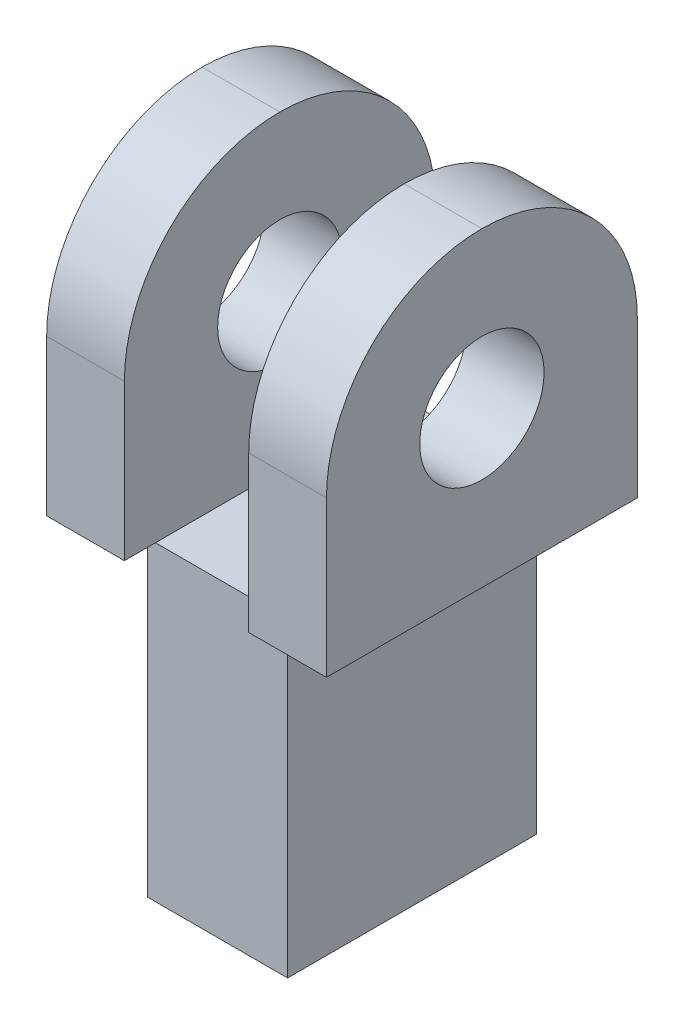
ISO-10303-21;
HEADER;
FILE_DESCRIPTION(('STEP AP214'),'2;1');
FILE_NAME('part.step','',(''),(''),'','','');
FILE_SCHEMA(('AUTOMOTIVE_DESIGN { 1 0 10303 214 1 1 1 1 }'));
ENDSEC;
DATA;
#1=APPLICATION_CONTEXT('core data for automotive mechanical design processes');
#2=APPLICATION_PROTOCOL_DEFINITION('international standard','automotive_design',2000,#1);
#3=PRODUCT_CONTEXT('',#1,'mechanical');
#4=PRODUCT('Part','Part','',(#3));
#5=PRODUCT_RELATED_PRODUCT_CATEGORY('part','',(#4));
#6=PRODUCT_DEFINITION_FORMATION('','',#4);
#7=PRODUCT_DEFINITION_CONTEXT('part definition',#1,'design');
#8=PRODUCT_DEFINITION('design','',#6,#7);
#9=PRODUCT_DEFINITION_SHAPE('','',#8);
#10=(LENGTH_UNIT() NAMED_UNIT(*) SI_UNIT(.MILLI.,.METRE.));
#11=(NAMED_UNIT(*) PLANE_ANGLE_UNIT() SI_UNIT($,.RADIAN.));
#12=(NAMED_UNIT(*) SI_UNIT($,.STERADIAN.) SOLID_ANGLE_UNIT());
#13=UNCERTAINTY_MEASURE_WITH_UNIT(LENGTH_MEASURE(1.E-05),#10,'distance_accuracy_value','');
#14=(GEOMETRIC_REPRESENTATION_CONTEXT(3) GLOBAL_UNCERTAINTY_ASSIGNED_CONTEXT((#13)) GLOBAL_UNIT_ASSIGNED_CONTEXT((#10,
#11,#12)) REPRESENTATION_CONTEXT('',''));
#15=CARTESIAN_POINT('',(0.,0.,0.));
#16=DIRECTION('',(0.,0.,1.));
#17=DIRECTION('',(1.,0.,0.));
#18=AXIS2_PLACEMENT_3D('',#15,#16,#17);
#19=CARTESIAN_POINT('',(0.,20.,0.));
#20=DIRECTION('',(0.,-1.,0.));
#21=DIRECTION('',(0.,0.,-1.));
#22=AXIS2_PLACEMENT_3D('',#19,#20,#21);
#23=PLANE('',#22);
#24=DIRECTION('',(0.,0.,-1.));
#25=VECTOR('',#24,1.);
#26=CARTESIAN_POINT('',(-4.,20.,-10.));
#27=LINE('',#26,#25);
#28=CARTESIAN_POINT('',(-4.,20.,8.));
#29=VERTEX_POINT('',#28);
#30=CARTESIAN_POINT('',(-4.,20.,-8.));
#31=VERTEX_POINT('',#30);
#32=EDGE_CURVE('E188',#29,#31,#27,.T.);
#33=ORIENTED_EDGE('',*,*,#32,.F.);
#34=DIRECTION('',(1.,0.,0.));
#35=VECTOR('',#34,1.);
#36=CARTESIAN_POINT('',(-4.5,20.,8.));
#37=LINE('',#36,#35);
#38=CARTESIAN_POINT('',(4.,20.,8.));
#39=VERTEX_POINT('',#38);
#40=EDGE_CURVE('E282',#29,#39,#37,.T.);
#41=ORIENTED_EDGE('',*,*,#40,.T.);
#42=DIRECTION('',(0.,0.,1.));
#43=VECTOR('',#42,1.);
#44=CARTESIAN_POINT('',(4.,20.,-10.));
#45=LINE('',#44,#43);
#46=CARTESIAN_POINT('',(4.,20.,-8.));
#47=VERTEX_POINT('',#46);
#48=EDGE_CURVE('E222',#47,#39,#45,.T.);
#49=ORIENTED_EDGE('',*,*,#48,.F.);
#50=DIRECTION('',(-1.,0.,0.));
#51=VECTOR('',#50,1.);
#52=CARTESIAN_POINT('',(-4.5,20.,-8.));
#53=LINE('',#52,#51);
#54=EDGE_CURVE('E269',#47,#31,#53,.T.);
#55=ORIENTED_EDGE('',*,*,#54,.T.);
#56=EDGE_LOOP('',(#33,#41,#49,#55));
#57=FACE_BOUND('',#56,.T.);
#58=ADVANCED_FACE('F33',(#57),#23,.F.);
#59=CARTESIAN_POINT('',(4.5,20.,8.));
#60=DIRECTION('',(-1.,0.,0.));
#61=DIRECTION('',(0.,0.,1.));
#62=AXIS2_PLACEMENT_3D('',#59,#60,#61);
#63=PLANE('',#62);
#64=DIRECTION('',(0.,0.,-1.));
#65=VECTOR('',#64,1.);
#66=CARTESIAN_POINT('',(4.5,0.,8.));
#67=LINE('',#66,#65);
#68=CARTESIAN_POINT('',(4.5,0.,8.));
#69=VERTEX_POINT('',#68);
#70=CARTESIAN_POINT('',(4.5,0.,-8.));
#71=VERTEX_POINT('',#70);
#72=EDGE_CURVE('E259',#69,#71,#67,.T.);
#73=ORIENTED_EDGE('',*,*,#72,.T.);
#74=DIRECTION('',(0.,-1.,0.));
#75=VECTOR('',#74,1.);
#76=CARTESIAN_POINT('',(4.5,20.,-8.));
#77=LINE('',#76,#75);
#78=CARTESIAN_POINT('',(4.5,20.,-8.));
#79=VERTEX_POINT('',#78);
#80=EDGE_CURVE('E298',#79,#71,#77,.T.);
#81=ORIENTED_EDGE('',*,*,#80,.F.);
#82=DIRECTION('',(0.,0.,-1.));
#83=VECTOR('',#82,1.);
#84=CARTESIAN_POINT('',(4.5,20.,8.));
#85=LINE('',#84,#83);
#86=CARTESIAN_POINT('',(4.5,20.,8.));
#87=VERTEX_POINT('',#86);
#88=EDGE_CURVE('E266',#87,#79,#85,.T.);
#89=ORIENTED_EDGE('',*,*,#88,.F.);
#90=DIRECTION('',(0.,-1.,0.));
#91=VECTOR('',#90,1.);
#92=CARTESIAN_POINT('',(4.5,20.,8.));
#93=LINE('',#92,#91);
#94=EDGE_CURVE('E281',#87,#69,#93,.T.);
#95=ORIENTED_EDGE('',*,*,#94,.T.);
#96=EDGE_LOOP('',(#73,#81,#89,#95));
#97=FACE_BOUND('',#96,.T.);
#98=ADVANCED_FACE('F373',(#97),#63,.F.);
#99=CARTESIAN_POINT('',(-4.5,20.,-8.));
#100=DIRECTION('',(0.,0.,1.));
#101=DIRECTION('',(1.,0.,0.));
#102=AXIS2_PLACEMENT_3D('',#99,#100,#101);
#103=PLANE('',#102);
#104=DIRECTION('',(-1.,0.,0.));
#105=VECTOR('',#104,1.);
#106=CARTESIAN_POINT('',(-4.5,0.,-8.));
#107=LINE('',#106,#105);
#108=CARTESIAN_POINT('',(-4.5,0.,-8.));
#109=VERTEX_POINT('',#108);
#110=EDGE_CURVE('E285',#71,#109,#107,.T.);
#111=ORIENTED_EDGE('',*,*,#110,.T.);
#112=DIRECTION('',(0.,-1.,0.));
#113=VECTOR('',#112,1.);
#114=CARTESIAN_POINT('',(-4.5,20.,-8.));
#115=LINE('',#114,#113);
#116=CARTESIAN_POINT('',(-4.5,20.,-8.));
#117=VERTEX_POINT('',#116);
#118=EDGE_CURVE('E295',#117,#109,#115,.T.);
#119=ORIENTED_EDGE('',*,*,#118,.F.);
#120=DIRECTION('',(-1.,0.,0.));
#121=VECTOR('',#120,1.);
#122=CARTESIAN_POINT('',(-4.5,20.,-8.));
#123=LINE('',#122,#121);
#124=EDGE_CURVE('E179',#31,#117,#123,.T.);
#125=ORIENTED_EDGE('',*,*,#124,.F.);
#126=ORIENTED_EDGE('',*,*,#54,.F.);
#127=EDGE_CURVE('E271',#79,#47,#53,.T.);
#128=ORIENTED_EDGE('',*,*,#127,.F.);
#129=ORIENTED_EDGE('',*,*,#80,.T.);
#130=EDGE_LOOP('',(#111,#119,#125,#126,#128,#129));
#131=FACE_BOUND('',#130,.T.);
#132=ADVANCED_FACE('F359',(#131),#103,.F.);
#133=CARTESIAN_POINT('',(-4.5,20.,8.));
#134=DIRECTION('',(1.,0.,0.));
#135=DIRECTION('',(0.,0.,-1.));
#136=AXIS2_PLACEMENT_3D('',#133,#134,#135);
#137=PLANE('',#136);
#138=DIRECTION('',(0.,0.,1.));
#139=VECTOR('',#138,1.);
#140=CARTESIAN_POINT('',(-4.5,0.,8.));
#141=LINE('',#140,#139);
#142=CARTESIAN_POINT('',(-4.5,0.,8.));
#143=VERTEX_POINT('',#142);
#144=EDGE_CURVE('E287',#109,#143,#141,.T.);
#145=ORIENTED_EDGE('',*,*,#144,.T.);
#146=DIRECTION('',(0.,-1.,0.));
#147=VECTOR('',#146,1.);
#148=CARTESIAN_POINT('',(-4.5,20.,8.));
#149=LINE('',#148,#147);
#150=CARTESIAN_POINT('',(-4.5,20.,8.));
#151=VERTEX_POINT('',#150);
#152=EDGE_CURVE('E292',#151,#143,#149,.T.);
#153=ORIENTED_EDGE('',*,*,#152,.F.);
#154=DIRECTION('',(0.,0.,1.));
#155=VECTOR('',#154,1.);
#156=CARTESIAN_POINT('',(-4.5,20.,8.));
#157=LINE('',#156,#155);
#158=EDGE_CURVE('E274',#117,#151,#157,.T.);
#159=ORIENTED_EDGE('',*,*,#158,.F.);
#160=ORIENTED_EDGE('',*,*,#118,.T.);
#161=EDGE_LOOP('',(#145,#153,#159,#160));
#162=FACE_BOUND('',#161,.T.);
#163=ADVANCED_FACE('F365',(#162),#137,.F.);
#164=CARTESIAN_POINT('',(-4.5,20.,8.));
#165=DIRECTION('',(0.,0.,-1.));
#166=DIRECTION('',(-1.,0.,0.));
#167=AXIS2_PLACEMENT_3D('',#164,#165,#166);
#168=PLANE('',#167);
#169=DIRECTION('',(1.,0.,0.));
#170=VECTOR('',#169,1.);
#171=CARTESIAN_POINT('',(-4.5,0.,8.));
#172=LINE('',#171,#170);
#173=EDGE_CURVE('E270',#143,#69,#172,.T.);
#174=ORIENTED_EDGE('',*,*,#173,.T.);
#175=ORIENTED_EDGE('',*,*,#94,.F.);
#176=EDGE_CURVE('E277',#39,#87,#37,.T.);
#177=ORIENTED_EDGE('',*,*,#176,.F.);
#178=ORIENTED_EDGE('',*,*,#40,.F.);
#179=EDGE_CURVE('E278',#151,#29,#37,.T.);
#180=ORIENTED_EDGE('',*,*,#179,.F.);
#181=ORIENTED_EDGE('',*,*,#152,.T.);
#182=EDGE_LOOP('',(#174,#175,#177,#178,#180,#181));
#183=FACE_BOUND('',#182,.T.);
#184=ADVANCED_FACE('F369',(#183),#168,.F.);
#185=CARTESIAN_POINT('',(0.,0.,0.));
#186=DIRECTION('',(0.,-1.,0.));
#187=DIRECTION('',(0.,0.,-1.));
#188=AXIS2_PLACEMENT_3D('',#185,#186,#187);
#189=PLANE('',#188);
#190=DIRECTION('',(0.,0.,1.));
#191=VECTOR('',#190,1.);
#192=CARTESIAN_POINT('',(4.1,0.,-7.6));
#193=LINE('',#192,#191);
#194=CARTESIAN_POINT('',(4.1,0.,-7.6));
#195=VERTEX_POINT('',#194);
#196=CARTESIAN_POINT('',(4.1,0.,7.6));
#197=VERTEX_POINT('',#196);
#198=EDGE_CURVE('E233',#195,#197,#193,.T.);
#199=ORIENTED_EDGE('',*,*,#198,.F.);
#200=DIRECTION('',(1.,0.,0.));
#201=VECTOR('',#200,1.);
#202=CARTESIAN_POINT('',(-4.1,0.,-7.6));
#203=LINE('',#202,#201);
#204=CARTESIAN_POINT('',(-4.1,0.,-7.6));
#205=VERTEX_POINT('',#204);
#206=EDGE_CURVE('E238',#205,#195,#203,.T.);
#207=ORIENTED_EDGE('',*,*,#206,.F.);
#208=DIRECTION('',(0.,0.,-1.));
#209=VECTOR('',#208,1.);
#210=CARTESIAN_POINT('',(-4.1,0.,-7.6));
#211=LINE('',#210,#209);
#212=CARTESIAN_POINT('',(-4.1,0.,7.6));
#213=VERTEX_POINT('',#212);
#214=EDGE_CURVE('E252',#213,#205,#211,.T.);
#215=ORIENTED_EDGE('',*,*,#214,.F.);
#216=DIRECTION('',(-1.,0.,0.));
#217=VECTOR('',#216,1.);
#218=CARTESIAN_POINT('',(-4.1,0.,7.6));
#219=LINE('',#218,#217);
#220=EDGE_CURVE('E249',#197,#213,#219,.T.);
#221=ORIENTED_EDGE('',*,*,#220,.F.);
#222=EDGE_LOOP('',(#199,#207,#215,#221));
#223=FACE_BOUND('',#222,.T.);
#224=ORIENTED_EDGE('',*,*,#72,.F.);
#225=ORIENTED_EDGE('',*,*,#173,.F.);
#226=ORIENTED_EDGE('',*,*,#144,.F.);
#227=ORIENTED_EDGE('',*,*,#110,.F.);
#228=EDGE_LOOP('',(#224,#225,#226,#227));
#229=FACE_BOUND('',#228,.T.);
#230=ADVANCED_FACE('F376',(#223,#229),#189,.T.);
#231=CARTESIAN_POINT('',(4.1,18.,-7.6));
#232=DIRECTION('',(1.,0.,0.));
#233=DIRECTION('',(0.,0.,-1.));
#234=AXIS2_PLACEMENT_3D('',#231,#232,#233);
#235=PLANE('',#234);
#236=ORIENTED_EDGE('',*,*,#198,.T.);
#237=DIRECTION('',(0.,-1.,0.));
#238=VECTOR('',#237,1.);
#239=CARTESIAN_POINT('',(4.1,18.,7.6));
#240=LINE('',#239,#238);
#241=CARTESIAN_POINT('',(4.1,18.,7.6));
#242=VERTEX_POINT('',#241);
#243=EDGE_CURVE('E247',#242,#197,#240,.T.);
#244=ORIENTED_EDGE('',*,*,#243,.F.);
#245=DIRECTION('',(0.,0.,1.));
#246=VECTOR('',#245,1.);
#247=CARTESIAN_POINT('',(4.1,18.,-7.6));
#248=LINE('',#247,#246);
#249=CARTESIAN_POINT('',(4.1,18.,-7.6));
#250=VERTEX_POINT('',#249);
#251=EDGE_CURVE('E234',#250,#242,#248,.T.);
#252=ORIENTED_EDGE('',*,*,#251,.F.);
#253=DIRECTION('',(0.,-1.,0.));
#254=VECTOR('',#253,1.);
#255=CARTESIAN_POINT('',(4.1,18.,-7.6));
#256=LINE('',#255,#254);
#257=EDGE_CURVE('E257',#250,#195,#256,.T.);
#258=ORIENTED_EDGE('',*,*,#257,.T.);
#259=EDGE_LOOP('',(#236,#244,#252,#258));
#260=FACE_BOUND('',#259,.T.);
#261=ADVANCED_FACE('F378',(#260),#235,.F.);
#262=CARTESIAN_POINT('',(-4.1,18.,-7.6));
#263=DIRECTION('',(0.,0.,-1.));
#264=DIRECTION('',(-1.,0.,0.));
#265=AXIS2_PLACEMENT_3D('',#262,#263,#264);
#266=PLANE('',#265);
#267=ORIENTED_EDGE('',*,*,#206,.T.);
#268=ORIENTED_EDGE('',*,*,#257,.F.);
#269=DIRECTION('',(1.,0.,0.));
#270=VECTOR('',#269,1.);
#271=CARTESIAN_POINT('',(-4.1,18.,-7.6));
#272=LINE('',#271,#270);
#273=CARTESIAN_POINT('',(-4.1,18.,-7.6));
#274=VERTEX_POINT('',#273);
#275=EDGE_CURVE('E244',#274,#250,#272,.T.);
#276=ORIENTED_EDGE('',*,*,#275,.F.);
#277=DIRECTION('',(0.,-1.,0.));
#278=VECTOR('',#277,1.);
#279=CARTESIAN_POINT('',(-4.1,18.,-7.6));
#280=LINE('',#279,#278);
#281=EDGE_CURVE('E260',#274,#205,#280,.T.);
#282=ORIENTED_EDGE('',*,*,#281,.T.);
#283=EDGE_LOOP('',(#267,#268,#276,#282));
#284=FACE_BOUND('',#283,.T.);
#285=ADVANCED_FACE('F385',(#284),#266,.F.);
#286=CARTESIAN_POINT('',(-4.1,18.,-7.6));
#287=DIRECTION('',(-1.,0.,0.));
#288=DIRECTION('',(0.,0.,1.));
#289=AXIS2_PLACEMENT_3D('',#286,#287,#288);
#290=PLANE('',#289);
#291=ORIENTED_EDGE('',*,*,#214,.T.);
#292=ORIENTED_EDGE('',*,*,#281,.F.);
#293=DIRECTION('',(0.,0.,-1.));
#294=VECTOR('',#293,1.);
#295=CARTESIAN_POINT('',(-4.1,18.,-7.6));
#296=LINE('',#295,#294);
#297=CARTESIAN_POINT('',(-4.1,18.,7.6));
#298=VERTEX_POINT('',#297);
#299=EDGE_CURVE('E241',#298,#274,#296,.T.);
#300=ORIENTED_EDGE('',*,*,#299,.F.);
#301=DIRECTION('',(0.,-1.,0.));
#302=VECTOR('',#301,1.);
#303=CARTESIAN_POINT('',(-4.1,18.,7.6));
#304=LINE('',#303,#302);
#305=EDGE_CURVE('E262',#298,#213,#304,.T.);
#306=ORIENTED_EDGE('',*,*,#305,.T.);
#307=EDGE_LOOP('',(#291,#292,#300,#306));
#308=FACE_BOUND('',#307,.T.);
#309=ADVANCED_FACE('F401',(#308),#290,.F.);
#310=CARTESIAN_POINT('',(-4.1,18.,7.6));
#311=DIRECTION('',(0.,0.,1.));
#312=DIRECTION('',(1.,0.,0.));
#313=AXIS2_PLACEMENT_3D('',#310,#311,#312);
#314=PLANE('',#313);
#315=ORIENTED_EDGE('',*,*,#220,.T.);
#316=ORIENTED_EDGE('',*,*,#305,.F.);
#317=DIRECTION('',(-1.,0.,0.));
#318=VECTOR('',#317,1.);
#319=CARTESIAN_POINT('',(-4.1,18.,7.6));
#320=LINE('',#319,#318);
#321=EDGE_CURVE('E237',#242,#298,#320,.T.);
#322=ORIENTED_EDGE('',*,*,#321,.F.);
#323=ORIENTED_EDGE('',*,*,#243,.T.);
#324=EDGE_LOOP('',(#315,#316,#322,#323));
#325=FACE_BOUND('',#324,.T.);
#326=ADVANCED_FACE('F397',(#325),#314,.F.);
#327=CARTESIAN_POINT('',(0.,18.,0.));
#328=DIRECTION('',(0.,1.,0.));
#329=DIRECTION('',(0.,0.,1.));
#330=AXIS2_PLACEMENT_3D('',#327,#328,#329);
#331=PLANE('',#330);
#332=ORIENTED_EDGE('',*,*,#251,.T.);
#333=ORIENTED_EDGE('',*,*,#321,.T.);
#334=ORIENTED_EDGE('',*,*,#299,.T.);
#335=ORIENTED_EDGE('',*,*,#275,.T.);
#336=EDGE_LOOP('',(#332,#333,#334,#335));
#337=FACE_BOUND('',#336,.T.);
#338=ADVANCED_FACE('F400',(#337),#331,.F.);
#339=CARTESIAN_POINT('',(0.,20.,0.));
#340=DIRECTION('',(0.,1.,0.));
#341=DIRECTION('',(0.,0.,1.));
#342=AXIS2_PLACEMENT_3D('',#339,#340,#341);
#343=PLANE('',#342);
#344=ORIENTED_EDGE('',*,*,#88,.T.);
#345=ORIENTED_EDGE('',*,*,#127,.T.);
#346=CARTESIAN_POINT('',(4.,20.,-10.));
#347=VERTEX_POINT('',#346);
#348=EDGE_CURVE('E218',#347,#47,#45,.T.);
#349=ORIENTED_EDGE('',*,*,#348,.F.);
#350=DIRECTION('',(-1.,0.,0.));
#351=VECTOR('',#350,1.);
#352=CARTESIAN_POINT('',(4.,20.,-10.));
#353=LINE('',#352,#351);
#354=CARTESIAN_POINT('',(9.,20.,-10.));
#355=VERTEX_POINT('',#354);
#356=EDGE_CURVE('E214',#355,#347,#353,.T.);
#357=ORIENTED_EDGE('',*,*,#356,.F.);
#358=DIRECTION('',(0.,0.,-1.));
#359=VECTOR('',#358,1.);
#360=CARTESIAN_POINT('',(9.,20.,-10.));
#361=LINE('',#360,#359);
#362=CARTESIAN_POINT('',(9.,20.,10.));
#363=VERTEX_POINT('',#362);
#364=EDGE_CURVE('E211',#363,#355,#361,.T.);
#365=ORIENTED_EDGE('',*,*,#364,.F.);
#366=DIRECTION('',(1.,0.,0.));
#367=VECTOR('',#366,1.);
#368=CARTESIAN_POINT('',(4.,20.,10.));
#369=LINE('',#368,#367);
#370=CARTESIAN_POINT('',(4.,20.,10.));
#371=VERTEX_POINT('',#370);
#372=EDGE_CURVE('E221',#371,#363,#369,.T.);
#373=ORIENTED_EDGE('',*,*,#372,.F.);
#374=EDGE_CURVE('E217',#39,#371,#45,.T.);
#375=ORIENTED_EDGE('',*,*,#374,.F.);
#376=ORIENTED_EDGE('',*,*,#176,.T.);
#377=EDGE_LOOP('',(#344,#345,#349,#357,#365,#373,#375,#376));
#378=FACE_BOUND('',#377,.T.);
#379=ADVANCED_FACE('F348',(#378),#343,.F.);
#380=CARTESIAN_POINT('',(9.,40.,-10.));
#381=DIRECTION('',(-1.,0.,0.));
#382=DIRECTION('',(0.,0.,1.));
#383=AXIS2_PLACEMENT_3D('',#380,#381,#382);
#384=PLANE('',#383);
#385=CARTESIAN_POINT('',(9.,30.,0.));
#386=DIRECTION('',(1.,0.,0.));
#387=DIRECTION('',(0.,0.,-1.));
#388=AXIS2_PLACEMENT_3D('',#385,#386,#387);
#389=CIRCLE('',#388,4.);
#390=CARTESIAN_POINT('',(9.,30.,-4.));
#391=VERTEX_POINT('',#390);
#392=EDGE_CURVE('E322',#391,#391,#389,.T.);
#393=ORIENTED_EDGE('',*,*,#392,.F.);
#394=EDGE_LOOP('',(#393));
#395=FACE_BOUND('',#394,.T.);
#396=CARTESIAN_POINT('',(9.,30.,0.));
#397=DIRECTION('',(-1.,0.,0.));
#398=DIRECTION('',(0.,0.,1.));
#399=AXIS2_PLACEMENT_3D('',#396,#397,#398);
#400=CIRCLE('',#399,10.);
#401=CARTESIAN_POINT('',(9.,30.,-10.));
#402=VERTEX_POINT('',#401);
#403=CARTESIAN_POINT('',(9.,40.,0.));
#404=VERTEX_POINT('',#403);
#405=EDGE_CURVE('E312',#402,#404,#400,.F.);
#406=ORIENTED_EDGE('',*,*,#405,.T.);
#407=CARTESIAN_POINT('',(9.,30.,0.));
#408=DIRECTION('',(-1.,0.,0.));
#409=DIRECTION('',(0.,0.,1.));
#410=AXIS2_PLACEMENT_3D('',#407,#408,#409);
#411=CIRCLE('',#410,10.);
#412=CARTESIAN_POINT('',(9.,30.,10.));
#413=VERTEX_POINT('',#412);
#414=EDGE_CURVE('E314',#404,#413,#411,.F.);
#415=ORIENTED_EDGE('',*,*,#414,.T.);
#416=DIRECTION('',(0.,-1.,0.));
#417=VECTOR('',#416,1.);
#418=CARTESIAN_POINT('',(9.,40.,10.));
#419=LINE('',#418,#417);
#420=EDGE_CURVE('E225',#413,#363,#419,.T.);
#421=ORIENTED_EDGE('',*,*,#420,.T.);
#422=ORIENTED_EDGE('',*,*,#364,.T.);
#423=DIRECTION('',(0.,-1.,0.));
#424=VECTOR('',#423,1.);
#425=CARTESIAN_POINT('',(9.,40.,-10.));
#426=LINE('',#425,#424);
#427=EDGE_CURVE('E231',#402,#355,#426,.T.);
#428=ORIENTED_EDGE('',*,*,#427,.F.);
#429=EDGE_LOOP('',(#406,#415,#421,#422,#428));
#430=FACE_BOUND('',#429,.T.);
#431=ADVANCED_FACE('F343',(#395,#430),#384,.F.);
#432=CARTESIAN_POINT('',(4.,40.,-10.));
#433=DIRECTION('',(0.,0.,1.));
#434=DIRECTION('',(1.,0.,0.));
#435=AXIS2_PLACEMENT_3D('',#432,#433,#434);
#436=PLANE('',#435);
#437=DIRECTION('',(0.,-1.,0.));
#438=VECTOR('',#437,1.);
#439=CARTESIAN_POINT('',(4.,40.,-10.));
#440=LINE('',#439,#438);
#441=CARTESIAN_POINT('',(4.,30.,-10.));
#442=VERTEX_POINT('',#441);
#443=EDGE_CURVE('E229',#442,#347,#440,.T.);
#444=ORIENTED_EDGE('',*,*,#443,.F.);
#445=DIRECTION('',(-1.,0.,0.));
#446=VECTOR('',#445,1.);
#447=CARTESIAN_POINT('',(9.,30.,-10.));
#448=LINE('',#447,#446);
#449=EDGE_CURVE('E11',#442,#402,#448,.F.);
#450=ORIENTED_EDGE('',*,*,#449,.T.);
#451=ORIENTED_EDGE('',*,*,#427,.T.);
#452=ORIENTED_EDGE('',*,*,#356,.T.);
#453=EDGE_LOOP('',(#444,#450,#451,#452));
#454=FACE_BOUND('',#453,.T.);
#455=ADVANCED_FACE('F340',(#454),#436,.F.);
#456=CARTESIAN_POINT('',(4.,40.,-10.));
#457=DIRECTION('',(1.,0.,0.));
#458=DIRECTION('',(0.,0.,-1.));
#459=AXIS2_PLACEMENT_3D('',#456,#457,#458);
#460=PLANE('',#459);
#461=CARTESIAN_POINT('',(4.,30.,0.));
#462=DIRECTION('',(1.,0.,0.));
#463=DIRECTION('',(0.,0.,-1.));
#464=AXIS2_PLACEMENT_3D('',#461,#462,#463);
#465=CIRCLE('',#464,4.);
#466=CARTESIAN_POINT('',(4.,30.,-4.));
#467=VERTEX_POINT('',#466);
#468=EDGE_CURVE('E191',#467,#467,#465,.T.);
#469=ORIENTED_EDGE('',*,*,#468,.T.);
#470=EDGE_LOOP('',(#469));
#471=FACE_BOUND('',#470,.T.);
#472=DIRECTION('',(0.,-1.,0.));
#473=VECTOR('',#472,1.);
#474=CARTESIAN_POINT('',(4.,40.,10.));
#475=LINE('',#474,#473);
#476=CARTESIAN_POINT('',(4.,30.,10.));
#477=VERTEX_POINT('',#476);
#478=EDGE_CURVE('E227',#477,#371,#475,.T.);
#479=ORIENTED_EDGE('',*,*,#478,.F.);
#480=CARTESIAN_POINT('',(4.,30.,0.));
#481=DIRECTION('',(1.,0.,0.));
#482=DIRECTION('',(0.,0.,-1.));
#483=AXIS2_PLACEMENT_3D('',#480,#481,#482);
#484=CIRCLE('',#483,10.);
#485=CARTESIAN_POINT('',(4.,40.,0.));
#486=VERTEX_POINT('',#485);
#487=EDGE_CURVE('E42',#477,#486,#484,.F.);
#488=ORIENTED_EDGE('',*,*,#487,.T.);
#489=CARTESIAN_POINT('',(4.,30.,0.));
#490=DIRECTION('',(1.,0.,0.));
#491=DIRECTION('',(0.,0.,-1.));
#492=AXIS2_PLACEMENT_3D('',#489,#490,#491);
#493=CIRCLE('',#492,10.);
#494=EDGE_CURVE('E50',#486,#442,#493,.F.);
#495=ORIENTED_EDGE('',*,*,#494,.T.);
#496=ORIENTED_EDGE('',*,*,#443,.T.);
#497=ORIENTED_EDGE('',*,*,#348,.T.);
#498=ORIENTED_EDGE('',*,*,#48,.T.);
#499=ORIENTED_EDGE('',*,*,#374,.T.);
#500=EDGE_LOOP('',(#479,#488,#495,#496,#497,#498,#499));
#501=FACE_BOUND('',#500,.T.);
#502=ADVANCED_FACE('F352',(#471,#501),#460,.F.);
#503=CARTESIAN_POINT('',(4.,40.,10.));
#504=DIRECTION('',(0.,0.,-1.));
#505=DIRECTION('',(-1.,0.,0.));
#506=AXIS2_PLACEMENT_3D('',#503,#504,#505);
#507=PLANE('',#506);
#508=ORIENTED_EDGE('',*,*,#420,.F.);
#509=DIRECTION('',(1.,0.,0.));
#510=VECTOR('',#509,1.);
#511=CARTESIAN_POINT('',(4.,30.,10.));
#512=LINE('',#511,#510);
#513=EDGE_CURVE('E316',#413,#477,#512,.F.);
#514=ORIENTED_EDGE('',*,*,#513,.T.);
#515=ORIENTED_EDGE('',*,*,#478,.T.);
#516=ORIENTED_EDGE('',*,*,#372,.T.);
#517=EDGE_LOOP('',(#508,#514,#515,#516));
#518=FACE_BOUND('',#517,.T.);
#519=ADVANCED_FACE('F419',(#518),#507,.F.);
#520=CARTESIAN_POINT('',(0.,20.,0.));
#521=DIRECTION('',(0.,1.,0.));
#522=DIRECTION('',(0.,0.,1.));
#523=AXIS2_PLACEMENT_3D('',#520,#521,#522);
#524=PLANE('',#523);
#525=CARTESIAN_POINT('',(-4.,20.,-10.));
#526=VERTEX_POINT('',#525);
#527=EDGE_CURVE('E184',#31,#526,#27,.T.);
#528=ORIENTED_EDGE('',*,*,#527,.F.);
#529=ORIENTED_EDGE('',*,*,#124,.T.);
#530=ORIENTED_EDGE('',*,*,#158,.T.);
#531=ORIENTED_EDGE('',*,*,#179,.T.);
#532=CARTESIAN_POINT('',(-4.,20.,10.));
#533=VERTEX_POINT('',#532);
#534=EDGE_CURVE('E193',#533,#29,#27,.T.);
#535=ORIENTED_EDGE('',*,*,#534,.F.);
#536=DIRECTION('',(1.,0.,0.));
#537=VECTOR('',#536,1.);
#538=CARTESIAN_POINT('',(-9.,20.,10.));
#539=LINE('',#538,#537);
#540=CARTESIAN_POINT('',(-9.,20.,10.));
#541=VERTEX_POINT('',#540);
#542=EDGE_CURVE('E199',#541,#533,#539,.T.);
#543=ORIENTED_EDGE('',*,*,#542,.F.);
#544=DIRECTION('',(0.,0.,1.));
#545=VECTOR('',#544,1.);
#546=CARTESIAN_POINT('',(-9.,20.,-10.));
#547=LINE('',#546,#545);
#548=CARTESIAN_POINT('',(-9.,20.,-10.));
#549=VERTEX_POINT('',#548);
#550=EDGE_CURVE('E197',#549,#541,#547,.T.);
#551=ORIENTED_EDGE('',*,*,#550,.F.);
#552=DIRECTION('',(-1.,0.,0.));
#553=VECTOR('',#552,1.);
#554=CARTESIAN_POINT('',(-9.,20.,-10.));
#555=LINE('',#554,#553);
#556=EDGE_CURVE('E174',#526,#549,#555,.T.);
#557=ORIENTED_EDGE('',*,*,#556,.F.);
#558=EDGE_LOOP('',(#528,#529,#530,#531,#535,#543,#551,#557));
#559=FACE_BOUND('',#558,.T.);
#560=ADVANCED_FACE('F194',(#559),#524,.F.);
#561=CARTESIAN_POINT('',(-4.,40.,-10.));
#562=DIRECTION('',(-1.,0.,0.));
#563=DIRECTION('',(0.,0.,1.));
#564=AXIS2_PLACEMENT_3D('',#561,#562,#563);
#565=PLANE('',#564);
#566=CARTESIAN_POINT('',(-4.,30.,0.));
#567=DIRECTION('',(-1.,0.,0.));
#568=DIRECTION('',(0.,0.,1.));
#569=AXIS2_PLACEMENT_3D('',#566,#567,#568);
#570=CIRCLE('',#569,4.);
#571=CARTESIAN_POINT('',(-4.,30.,4.));
#572=VERTEX_POINT('',#571);
#573=EDGE_CURVE('E458',#572,#572,#570,.T.);
#574=ORIENTED_EDGE('',*,*,#573,.T.);
#575=EDGE_LOOP('',(#574));
#576=FACE_BOUND('',#575,.T.);
#577=DIRECTION('',(0.,-1.,0.));
#578=VECTOR('',#577,1.);
#579=CARTESIAN_POINT('',(-4.,40.,-10.));
#580=LINE('',#579,#578);
#581=CARTESIAN_POINT('',(-4.,30.,-10.));
#582=VERTEX_POINT('',#581);
#583=EDGE_CURVE('E169',#582,#526,#580,.T.);
#584=ORIENTED_EDGE('',*,*,#583,.F.);
#585=CARTESIAN_POINT('',(-4.,30.,0.));
#586=DIRECTION('',(-1.,0.,0.));
#587=DIRECTION('',(0.,0.,1.));
#588=AXIS2_PLACEMENT_3D('',#585,#586,#587);
#589=CIRCLE('',#588,10.);
#590=CARTESIAN_POINT('',(-4.,40.,0.));
#591=VERTEX_POINT('',#590);
#592=EDGE_CURVE('E308',#582,#591,#589,.F.);
#593=ORIENTED_EDGE('',*,*,#592,.T.);
#594=CARTESIAN_POINT('',(-4.,30.,0.));
#595=DIRECTION('',(-1.,0.,0.));
#596=DIRECTION('',(0.,0.,1.));
#597=AXIS2_PLACEMENT_3D('',#594,#595,#596);
#598=CIRCLE('',#597,10.);
#599=CARTESIAN_POINT('',(-4.,30.,10.));
#600=VERTEX_POINT('',#599);
#601=EDGE_CURVE('E306',#591,#600,#598,.F.);
#602=ORIENTED_EDGE('',*,*,#601,.T.);
#603=DIRECTION('',(0.,-1.,0.));
#604=VECTOR('',#603,1.);
#605=CARTESIAN_POINT('',(-4.,40.,10.));
#606=LINE('',#605,#604);
#607=EDGE_CURVE('E205',#600,#533,#606,.T.);
#608=ORIENTED_EDGE('',*,*,#607,.T.);
#609=ORIENTED_EDGE('',*,*,#534,.T.);
#610=ORIENTED_EDGE('',*,*,#32,.T.);
#611=ORIENTED_EDGE('',*,*,#527,.T.);
#612=EDGE_LOOP('',(#584,#593,#602,#608,#609,#610,#611));
#613=FACE_BOUND('',#612,.T.);
#614=ADVANCED_FACE('F185',(#576,#613),#565,.F.);
#615=CARTESIAN_POINT('',(-9.,40.,-10.));
#616=DIRECTION('',(0.,0.,1.));
#617=DIRECTION('',(1.,0.,0.));
#618=AXIS2_PLACEMENT_3D('',#615,#616,#617);
#619=PLANE('',#618);
#620=DIRECTION('',(0.,-1.,0.));
#621=VECTOR('',#620,1.);
#622=CARTESIAN_POINT('',(-9.,40.,-10.));
#623=LINE('',#622,#621);
#624=CARTESIAN_POINT('',(-9.,30.,-10.));
#625=VERTEX_POINT('',#624);
#626=EDGE_CURVE('E180',#625,#549,#623,.T.);
#627=ORIENTED_EDGE('',*,*,#626,.F.);
#628=DIRECTION('',(-1.,0.,0.));
#629=VECTOR('',#628,1.);
#630=CARTESIAN_POINT('',(-4.,30.,-10.));
#631=LINE('',#630,#629);
#632=EDGE_CURVE('E177',#625,#582,#631,.F.);
#633=ORIENTED_EDGE('',*,*,#632,.T.);
#634=ORIENTED_EDGE('',*,*,#583,.T.);
#635=ORIENTED_EDGE('',*,*,#556,.T.);
#636=EDGE_LOOP('',(#627,#633,#634,#635));
#637=FACE_BOUND('',#636,.T.);
#638=ADVANCED_FACE('F172',(#637),#619,.F.);
#639=CARTESIAN_POINT('',(-9.,40.,-10.));
#640=DIRECTION('',(1.,0.,0.));
#641=DIRECTION('',(0.,0.,-1.));
#642=AXIS2_PLACEMENT_3D('',#639,#640,#641);
#643=PLANE('',#642);
#644=CARTESIAN_POINT('',(-9.00000000000001,30.,0.));
#645=DIRECTION('',(1.,0.,0.));
#646=DIRECTION('',(0.,0.,-1.));
#647=AXIS2_PLACEMENT_3D('',#644,#645,#646);
#648=CIRCLE('',#647,4.);
#649=CARTESIAN_POINT('',(-9.00000000000001,30.,-4.));
#650=VERTEX_POINT('',#649);
#651=EDGE_CURVE('E327',#650,#650,#648,.T.);
#652=ORIENTED_EDGE('',*,*,#651,.T.);
#653=EDGE_LOOP('',(#652));
#654=FACE_BOUND('',#653,.T.);
#655=CARTESIAN_POINT('',(-9.,30.,0.));
#656=DIRECTION('',(1.,0.,0.));
#657=DIRECTION('',(0.,0.,-1.));
#658=AXIS2_PLACEMENT_3D('',#655,#656,#657);
#659=CIRCLE('',#658,10.);
#660=CARTESIAN_POINT('',(-9.,30.,10.));
#661=VERTEX_POINT('',#660);
#662=CARTESIAN_POINT('',(-9.,40.,0.));
#663=VERTEX_POINT('',#662);
#664=EDGE_CURVE('E301',#661,#663,#659,.F.);
#665=ORIENTED_EDGE('',*,*,#664,.T.);
#666=CARTESIAN_POINT('',(-9.,30.,0.));
#667=DIRECTION('',(1.,0.,0.));
#668=DIRECTION('',(0.,0.,-1.));
#669=AXIS2_PLACEMENT_3D('',#666,#667,#668);
#670=CIRCLE('',#669,10.);
#671=EDGE_CURVE('E303',#663,#625,#670,.F.);
#672=ORIENTED_EDGE('',*,*,#671,.T.);
#673=ORIENTED_EDGE('',*,*,#626,.T.);
#674=ORIENTED_EDGE('',*,*,#550,.T.);
#675=DIRECTION('',(0.,-1.,0.));
#676=VECTOR('',#675,1.);
#677=CARTESIAN_POINT('',(-9.,40.,10.));
#678=LINE('',#677,#676);
#679=EDGE_CURVE('E207',#661,#541,#678,.T.);
#680=ORIENTED_EDGE('',*,*,#679,.F.);
#681=EDGE_LOOP('',(#665,#672,#673,#674,#680));
#682=FACE_BOUND('',#681,.T.);
#683=ADVANCED_FACE('F431',(#654,#682),#643,.F.);
#684=CARTESIAN_POINT('',(-9.,40.,10.));
#685=DIRECTION('',(0.,0.,-1.));
#686=DIRECTION('',(-1.,0.,0.));
#687=AXIS2_PLACEMENT_3D('',#684,#685,#686);
#688=PLANE('',#687);
#689=ORIENTED_EDGE('',*,*,#607,.F.);
#690=DIRECTION('',(1.,0.,0.));
#691=VECTOR('',#690,1.);
#692=CARTESIAN_POINT('',(-9.,30.,10.));
#693=LINE('',#692,#691);
#694=EDGE_CURVE('E310',#600,#661,#693,.F.);
#695=ORIENTED_EDGE('',*,*,#694,.T.);
#696=ORIENTED_EDGE('',*,*,#679,.T.);
#697=ORIENTED_EDGE('',*,*,#542,.T.);
#698=EDGE_LOOP('',(#689,#695,#696,#697));
#699=FACE_BOUND('',#698,.T.);
#700=ADVANCED_FACE('F434',(#699),#688,.F.);
#701=CARTESIAN_POINT('',(-9.00000000000001,30.,0.));
#702=DIRECTION('',(1.,0.,0.));
#703=DIRECTION('',(0.,0.,-1.));
#704=AXIS2_PLACEMENT_3D('',#701,#702,#703);
#705=CYLINDRICAL_SURFACE('',#704,4.);
#706=ORIENTED_EDGE('',*,*,#651,.F.);
#707=EDGE_LOOP('',(#706));
#708=FACE_BOUND('',#707,.T.);
#709=ORIENTED_EDGE('',*,*,#573,.F.);
#710=EDGE_LOOP('',(#709));
#711=FACE_BOUND('',#710,.T.);
#712=ADVANCED_FACE('F438',(#708,#711),#705,.F.);
#713=ORIENTED_EDGE('',*,*,#392,.T.);
#714=EDGE_LOOP('',(#713));
#715=FACE_BOUND('',#714,.T.);
#716=ORIENTED_EDGE('',*,*,#468,.F.);
#717=EDGE_LOOP('',(#716));
#718=FACE_BOUND('',#717,.T.);
#719=ADVANCED_FACE('F442',(#715,#718),#705,.F.);
#720=CARTESIAN_POINT('',(0.,30.,0.));
#721=DIRECTION('',(-1.,0.,0.));
#722=DIRECTION('',(0.,0.,1.));
#723=AXIS2_PLACEMENT_3D('',#720,#721,#722);
#724=CYLINDRICAL_SURFACE('',#723,10.);
#725=ORIENTED_EDGE('',*,*,#694,.F.);
#726=ORIENTED_EDGE('',*,*,#601,.F.);
#727=DIRECTION('',(1.,0.,0.));
#728=VECTOR('',#727,1.);
#729=CARTESIAN_POINT('',(-4.,40.,0.));
#730=LINE('',#729,#728);
#731=EDGE_CURVE('E320',#663,#591,#730,.T.);
#732=ORIENTED_EDGE('',*,*,#731,.F.);
#733=ORIENTED_EDGE('',*,*,#664,.F.);
#734=EDGE_LOOP('',(#725,#726,#732,#733));
#735=FACE_BOUND('',#734,.T.);
#736=ADVANCED_FACE('F444',(#735),#724,.T.);
#737=CARTESIAN_POINT('',(0.,30.,0.));
#738=DIRECTION('',(1.,0.,0.));
#739=DIRECTION('',(0.,0.,-1.));
#740=AXIS2_PLACEMENT_3D('',#737,#738,#739);
#741=CYLINDRICAL_SURFACE('',#740,10.);
#742=ORIENTED_EDGE('',*,*,#592,.F.);
#743=ORIENTED_EDGE('',*,*,#632,.F.);
#744=ORIENTED_EDGE('',*,*,#671,.F.);
#745=ORIENTED_EDGE('',*,*,#731,.T.);
#746=EDGE_LOOP('',(#742,#743,#744,#745));
#747=FACE_BOUND('',#746,.T.);
#748=ADVANCED_FACE('F450',(#747),#741,.T.);
#749=CARTESIAN_POINT('',(0.,30.,0.));
#750=DIRECTION('',(1.,0.,0.));
#751=DIRECTION('',(0.,0.,-1.));
#752=AXIS2_PLACEMENT_3D('',#749,#750,#751);
#753=CYLINDRICAL_SURFACE('',#752,10.);
#754=ORIENTED_EDGE('',*,*,#449,.F.);
#755=ORIENTED_EDGE('',*,*,#494,.F.);
#756=DIRECTION('',(-1.,0.,0.));
#757=VECTOR('',#756,1.);
#758=CARTESIAN_POINT('',(4.,40.,0.));
#759=LINE('',#758,#757);
#760=EDGE_CURVE('E37',#404,#486,#759,.T.);
#761=ORIENTED_EDGE('',*,*,#760,.F.);
#762=ORIENTED_EDGE('',*,*,#405,.F.);
#763=EDGE_LOOP('',(#754,#755,#761,#762));
#764=FACE_BOUND('',#763,.T.);
#765=ADVANCED_FACE('F35',(#764),#753,.T.);
#766=CARTESIAN_POINT('',(0.,30.,0.));
#767=DIRECTION('',(-1.,0.,0.));
#768=DIRECTION('',(0.,0.,1.));
#769=AXIS2_PLACEMENT_3D('',#766,#767,#768);
#770=CYLINDRICAL_SURFACE('',#769,10.);
#771=ORIENTED_EDGE('',*,*,#487,.F.);
#772=ORIENTED_EDGE('',*,*,#513,.F.);
#773=ORIENTED_EDGE('',*,*,#414,.F.);
#774=ORIENTED_EDGE('',*,*,#760,.T.);
#775=EDGE_LOOP('',(#771,#772,#773,#774));
#776=FACE_BOUND('',#775,.T.);
#777=ADVANCED_FACE('F333',(#776),#770,.T.);
#778=CLOSED_SHELL('',(#58,#98,#132,#163,#184,#230,#261,#285,#309,#326,#338,#379,#431,#455,#502,
#519,#560,#614,#638,#683,#700,#712,#719,#736,#748,#765,#777));
#779=MANIFOLD_SOLID_BREP('B2',#778);
#780=ADVANCED_BREP_SHAPE_REPRESENTATION('',(#18,#779),#14);
#781=SHAPE_DEFINITION_REPRESENTATION(#9,#780);
ENDSEC;
END-ISO-10303-21;
